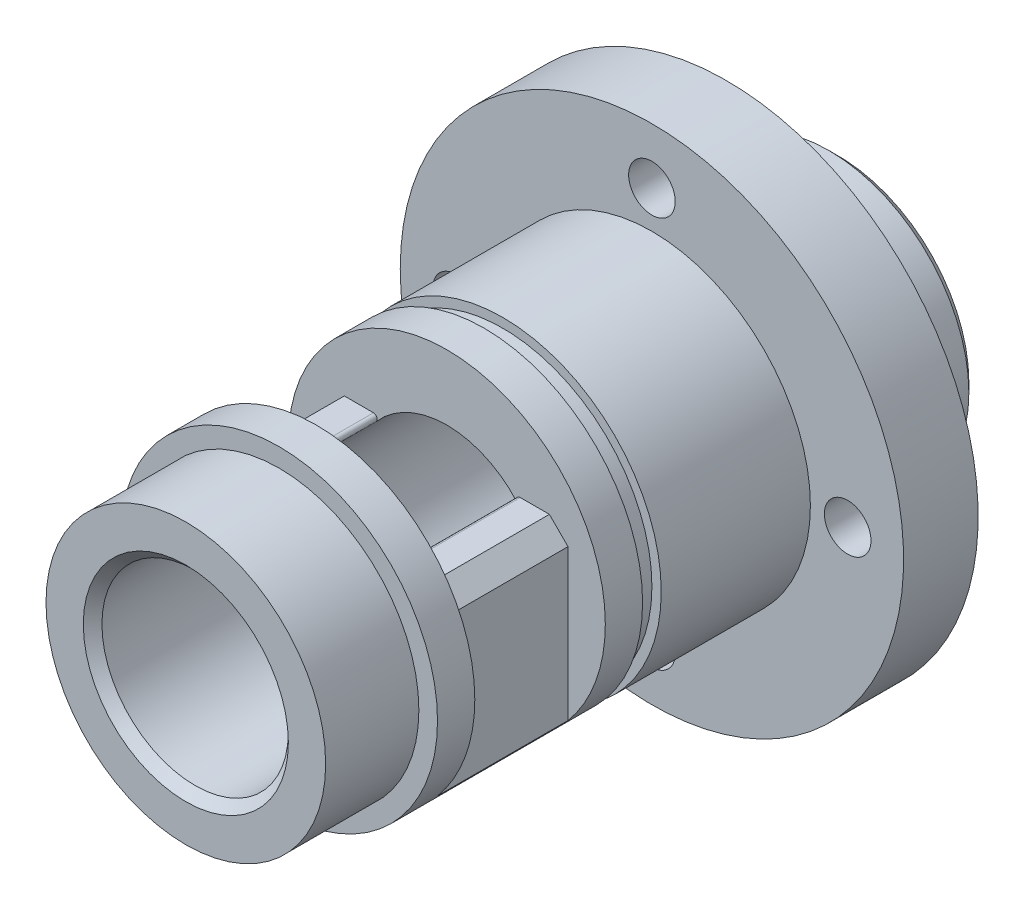
ISO-10303-21;
HEADER;
FILE_DESCRIPTION(('STEP AP214'),'2;1');
FILE_NAME('part.step','',(''),(''),'','','');
FILE_SCHEMA(('AUTOMOTIVE_DESIGN { 1 0 10303 214 1 1 1 1 }'));
ENDSEC;
DATA;
#1=APPLICATION_CONTEXT('core data for automotive mechanical design processes');
#2=APPLICATION_PROTOCOL_DEFINITION('international standard','automotive_design',2000,#1);
#3=PRODUCT_CONTEXT('',#1,'mechanical');
#4=PRODUCT('Part','Part','',(#3));
#5=PRODUCT_RELATED_PRODUCT_CATEGORY('part','',(#4));
#6=PRODUCT_DEFINITION_FORMATION('','',#4);
#7=PRODUCT_DEFINITION_CONTEXT('part definition',#1,'design');
#8=PRODUCT_DEFINITION('design','',#6,#7);
#9=PRODUCT_DEFINITION_SHAPE('','',#8);
#10=(LENGTH_UNIT() NAMED_UNIT(*) SI_UNIT(.MILLI.,.METRE.));
#11=(NAMED_UNIT(*) PLANE_ANGLE_UNIT() SI_UNIT($,.RADIAN.));
#12=(NAMED_UNIT(*) SI_UNIT($,.STERADIAN.) SOLID_ANGLE_UNIT());
#13=UNCERTAINTY_MEASURE_WITH_UNIT(LENGTH_MEASURE(1.E-05),#10,'distance_accuracy_value','');
#14=(GEOMETRIC_REPRESENTATION_CONTEXT(3) GLOBAL_UNCERTAINTY_ASSIGNED_CONTEXT((#13)) GLOBAL_UNIT_ASSIGNED_CONTEXT((#10,
#11,#12)) REPRESENTATION_CONTEXT('',''));
#15=CARTESIAN_POINT('',(0.,0.,0.));
#16=DIRECTION('',(0.,0.,1.));
#17=DIRECTION('',(1.,0.,0.));
#18=AXIS2_PLACEMENT_3D('',#15,#16,#17);
#19=CARTESIAN_POINT('',(0.,0.,20.));
#20=DIRECTION('',(0.,0.,-1.));
#21=DIRECTION('',(-1.,0.,0.));
#22=AXIS2_PLACEMENT_3D('',#19,#20,#21);
#23=CYLINDRICAL_SURFACE('',#22,8.5);
#24=CARTESIAN_POINT('',(0.,0.,11.));
#25=DIRECTION('',(0.,0.,1.));
#26=DIRECTION('',(1.,0.,0.));
#27=AXIS2_PLACEMENT_3D('',#24,#25,#26);
#28=CIRCLE('',#27,8.5);
#29=CARTESIAN_POINT('',(6.5,-5.47722557505166,11.));
#30=VERTEX_POINT('',#29);
#31=CARTESIAN_POINT('',(-6.5,-5.47722557505166,11.));
#32=VERTEX_POINT('',#31);
#33=EDGE_CURVE('E125',#30,#32,#28,.T.);
#34=ORIENTED_EDGE('',*,*,#33,.F.);
#35=DIRECTION('',(0.,0.,-1.));
#36=VECTOR('',#35,1.);
#37=CARTESIAN_POINT('',(6.5,-5.47722557505166,20.));
#38=LINE('',#37,#36);
#39=CARTESIAN_POINT('',(6.5,-5.47722557505166,18.));
#40=VERTEX_POINT('',#39);
#41=EDGE_CURVE('E128',#30,#40,#38,.F.);
#42=ORIENTED_EDGE('',*,*,#41,.T.);
#43=CARTESIAN_POINT('',(0.,0.,18.));
#44=DIRECTION('',(0.,0.,1.));
#45=DIRECTION('',(1.,0.,0.));
#46=AXIS2_PLACEMENT_3D('',#43,#44,#45);
#47=CIRCLE('',#46,8.5);
#48=CARTESIAN_POINT('',(-6.5,-5.47722557505167,18.));
#49=VERTEX_POINT('',#48);
#50=EDGE_CURVE('E178',#40,#49,#47,.T.);
#51=ORIENTED_EDGE('',*,*,#50,.T.);
#52=DIRECTION('',(0.,0.,-1.));
#53=VECTOR('',#52,1.);
#54=CARTESIAN_POINT('',(-6.5,-5.47722557505167,20.));
#55=LINE('',#54,#53);
#56=EDGE_CURVE('E130',#49,#32,#55,.T.);
#57=ORIENTED_EDGE('',*,*,#56,.T.);
#58=EDGE_LOOP('',(#34,#42,#51,#57));
#59=FACE_BOUND('',#58,.T.);
#60=CARTESIAN_POINT('',(0.,0.,9.));
#61=DIRECTION('',(0.,0.,1.));
#62=DIRECTION('',(1.,0.,0.));
#63=AXIS2_PLACEMENT_3D('',#60,#61,#62);
#64=CIRCLE('',#63,8.5);
#65=CARTESIAN_POINT('',(8.5,0.,9.));
#66=VERTEX_POINT('',#65);
#67=EDGE_CURVE('E210',#66,#66,#64,.T.);
#68=ORIENTED_EDGE('',*,*,#67,.T.);
#69=EDGE_LOOP('',(#68));
#70=FACE_BOUND('',#69,.T.);
#71=CARTESIAN_POINT('',(0.,0.,20.));
#72=DIRECTION('',(0.,0.,1.));
#73=DIRECTION('',(1.,0.,0.));
#74=AXIS2_PLACEMENT_3D('',#71,#72,#73);
#75=CIRCLE('',#74,8.5);
#76=CARTESIAN_POINT('',(8.5,0.,20.));
#77=VERTEX_POINT('',#76);
#78=EDGE_CURVE('E219',#77,#77,#75,.T.);
#79=ORIENTED_EDGE('',*,*,#78,.F.);
#80=EDGE_LOOP('',(#79));
#81=FACE_BOUND('',#80,.T.);
#82=CARTESIAN_POINT('',(0.,0.,11.));
#83=DIRECTION('',(0.,0.,1.));
#84=DIRECTION('',(1.,0.,0.));
#85=AXIS2_PLACEMENT_3D('',#82,#83,#84);
#86=CIRCLE('',#85,8.5);
#87=CARTESIAN_POINT('',(-6.02079728939615,-6.,11.));
#88=VERTEX_POINT('',#87);
#89=CARTESIAN_POINT('',(6.02079728939615,-6.,11.));
#90=VERTEX_POINT('',#89);
#91=EDGE_CURVE('E164',#88,#90,#86,.T.);
#92=ORIENTED_EDGE('',*,*,#91,.F.);
#93=DIRECTION('',(0.,0.,1.));
#94=VECTOR('',#93,1.);
#95=CARTESIAN_POINT('',(-6.02079728939615,-6.,11.));
#96=LINE('',#95,#94);
#97=CARTESIAN_POINT('',(-6.02079728939615,-6.,18.));
#98=VERTEX_POINT('',#97);
#99=EDGE_CURVE('E175',#88,#98,#96,.T.);
#100=ORIENTED_EDGE('',*,*,#99,.T.);
#101=CARTESIAN_POINT('',(0.,0.,18.));
#102=DIRECTION('',(0.,0.,1.));
#103=DIRECTION('',(1.,0.,0.));
#104=AXIS2_PLACEMENT_3D('',#101,#102,#103);
#105=CIRCLE('',#104,8.5);
#106=CARTESIAN_POINT('',(6.02079728939615,-6.,18.));
#107=VERTEX_POINT('',#106);
#108=EDGE_CURVE('E163',#98,#107,#105,.T.);
#109=ORIENTED_EDGE('',*,*,#108,.T.);
#110=DIRECTION('',(0.,0.,1.));
#111=VECTOR('',#110,1.);
#112=CARTESIAN_POINT('',(6.02079728939615,-6.,11.));
#113=LINE('',#112,#111);
#114=EDGE_CURVE('E170',#90,#107,#113,.T.);
#115=ORIENTED_EDGE('',*,*,#114,.F.);
#116=EDGE_LOOP('',(#92,#100,#109,#115));
#117=FACE_BOUND('',#116,.T.);
#118=ADVANCED_FACE('F37',(#59,#70,#81,#117),#23,.T.);
#119=CARTESIAN_POINT('',(0.,0.,25.));
#120=DIRECTION('',(0.,0.,-1.));
#121=DIRECTION('',(-1.,0.,0.));
#122=AXIS2_PLACEMENT_3D('',#119,#120,#121);
#123=CYLINDRICAL_SURFACE('',#122,5.);
#124=CARTESIAN_POINT('',(0.,0.,24.5));
#125=DIRECTION('',(0.,0.,1.));
#126=DIRECTION('',(1.,0.,0.));
#127=AXIS2_PLACEMENT_3D('',#124,#125,#126);
#128=CIRCLE('',#127,5.);
#129=CARTESIAN_POINT('',(5.,0.,24.5));
#130=VERTEX_POINT('',#129);
#131=EDGE_CURVE('E237',#130,#130,#128,.T.);
#132=ORIENTED_EDGE('',*,*,#131,.T.);
#133=EDGE_LOOP('',(#132));
#134=FACE_BOUND('',#133,.T.);
#135=CARTESIAN_POINT('',(0.,0.,-10.));
#136=DIRECTION('',(0.,0.,-1.));
#137=DIRECTION('',(-1.,0.,0.));
#138=AXIS2_PLACEMENT_3D('',#135,#136,#137);
#139=CIRCLE('',#138,5.);
#140=CARTESIAN_POINT('',(-5.,0.,-10.));
#141=VERTEX_POINT('',#140);
#142=EDGE_CURVE('E184',#141,#141,#139,.T.);
#143=ORIENTED_EDGE('',*,*,#142,.T.);
#144=EDGE_LOOP('',(#143));
#145=FACE_BOUND('',#144,.T.);
#146=DIRECTION('',(0.,0.,-1.));
#147=VECTOR('',#146,1.);
#148=CARTESIAN_POINT('',(-3.78313761017423,3.26923076923077,25.));
#149=LINE('',#148,#147);
#150=CARTESIAN_POINT('',(-3.78313761017423,3.26923076923077,11.));
#151=VERTEX_POINT('',#150);
#152=CARTESIAN_POINT('',(-3.78313761017423,3.26923076923077,18.));
#153=VERTEX_POINT('',#152);
#154=EDGE_CURVE('E261',#151,#153,#149,.F.);
#155=ORIENTED_EDGE('',*,*,#154,.T.);
#156=CARTESIAN_POINT('',(0.,0.,18.));
#157=DIRECTION('',(0.,0.,1.));
#158=DIRECTION('',(1.,0.,0.));
#159=AXIS2_PLACEMENT_3D('',#156,#157,#158);
#160=CIRCLE('',#159,5.);
#161=CARTESIAN_POINT('',(3.78313761017423,3.26923076923077,18.));
#162=VERTEX_POINT('',#161);
#163=EDGE_CURVE('E230',#153,#162,#160,.F.);
#164=ORIENTED_EDGE('',*,*,#163,.T.);
#165=DIRECTION('',(0.,0.,-1.));
#166=VECTOR('',#165,1.);
#167=CARTESIAN_POINT('',(3.78313761017423,3.26923076923077,25.));
#168=LINE('',#167,#166);
#169=CARTESIAN_POINT('',(3.78313761017423,3.26923076923077,11.));
#170=VERTEX_POINT('',#169);
#171=EDGE_CURVE('E258',#162,#170,#168,.T.);
#172=ORIENTED_EDGE('',*,*,#171,.T.);
#173=CARTESIAN_POINT('',(0.,0.,11.));
#174=DIRECTION('',(0.,0.,1.));
#175=DIRECTION('',(1.,0.,0.));
#176=AXIS2_PLACEMENT_3D('',#173,#174,#175);
#177=CIRCLE('',#176,5.);
#178=EDGE_CURVE('E232',#151,#170,#177,.F.);
#179=ORIENTED_EDGE('',*,*,#178,.F.);
#180=EDGE_LOOP('',(#155,#164,#172,#179));
#181=FACE_BOUND('',#180,.T.);
#182=ADVANCED_FACE('F279',(#134,#145,#181),#123,.F.);
#183=CARTESIAN_POINT('',(0.,0.,20.));
#184=DIRECTION('',(0.,0.,1.));
#185=DIRECTION('',(1.,0.,0.));
#186=AXIS2_PLACEMENT_3D('',#183,#184,#185);
#187=PLANE('',#186);
#188=CARTESIAN_POINT('',(0.,0.,20.));
#189=DIRECTION('',(0.,0.,1.));
#190=DIRECTION('',(1.,0.,0.));
#191=AXIS2_PLACEMENT_3D('',#188,#189,#190);
#192=CIRCLE('',#191,7.5);
#193=CARTESIAN_POINT('',(7.5,0.,20.));
#194=VERTEX_POINT('',#193);
#195=EDGE_CURVE('E213',#194,#194,#192,.T.);
#196=ORIENTED_EDGE('',*,*,#195,.F.);
#197=EDGE_LOOP('',(#196));
#198=FACE_BOUND('',#197,.T.);
#199=ORIENTED_EDGE('',*,*,#78,.T.);
#200=EDGE_LOOP('',(#199));
#201=FACE_BOUND('',#200,.T.);
#202=ADVANCED_FACE('F314',(#198,#201),#187,.T.);
#203=CARTESIAN_POINT('',(0.,0.,25.));
#204=DIRECTION('',(0.,0.,-1.));
#205=DIRECTION('',(-1.,0.,0.));
#206=AXIS2_PLACEMENT_3D('',#203,#204,#205);
#207=CYLINDRICAL_SURFACE('',#206,7.5);
#208=CARTESIAN_POINT('',(0.,0.,25.));
#209=DIRECTION('',(0.,0.,1.));
#210=DIRECTION('',(1.,0.,0.));
#211=AXIS2_PLACEMENT_3D('',#208,#209,#210);
#212=CIRCLE('',#211,7.5);
#213=CARTESIAN_POINT('',(7.5,0.,25.));
#214=VERTEX_POINT('',#213);
#215=EDGE_CURVE('E216',#214,#214,#212,.T.);
#216=ORIENTED_EDGE('',*,*,#215,.F.);
#217=EDGE_LOOP('',(#216));
#218=FACE_BOUND('',#217,.T.);
#219=ORIENTED_EDGE('',*,*,#195,.T.);
#220=EDGE_LOOP('',(#219));
#221=FACE_BOUND('',#220,.T.);
#222=ADVANCED_FACE('F352',(#218,#221),#207,.T.);
#223=CARTESIAN_POINT('',(0.,0.,25.));
#224=DIRECTION('',(0.,0.,1.));
#225=DIRECTION('',(1.,0.,0.));
#226=AXIS2_PLACEMENT_3D('',#223,#224,#225);
#227=PLANE('',#226);
#228=CARTESIAN_POINT('',(0.,0.,25.));
#229=DIRECTION('',(0.,0.,1.));
#230=DIRECTION('',(1.,0.,0.));
#231=AXIS2_PLACEMENT_3D('',#228,#229,#230);
#232=CIRCLE('',#231,5.50000000000001);
#233=CARTESIAN_POINT('',(5.50000000000001,0.,25.));
#234=VERTEX_POINT('',#233);
#235=EDGE_CURVE('E234',#234,#234,#232,.F.);
#236=ORIENTED_EDGE('',*,*,#235,.T.);
#237=EDGE_LOOP('',(#236));
#238=FACE_BOUND('',#237,.T.);
#239=ORIENTED_EDGE('',*,*,#215,.T.);
#240=EDGE_LOOP('',(#239));
#241=FACE_BOUND('',#240,.T.);
#242=ADVANCED_FACE('F346',(#238,#241),#227,.T.);
#243=CARTESIAN_POINT('',(0.,0.,9.));
#244=DIRECTION('',(0.,0.,1.));
#245=DIRECTION('',(1.,0.,0.));
#246=AXIS2_PLACEMENT_3D('',#243,#244,#245);
#247=PLANE('',#246);
#248=ORIENTED_EDGE('',*,*,#67,.F.);
#249=EDGE_LOOP('',(#248));
#250=FACE_BOUND('',#249,.T.);
#251=CARTESIAN_POINT('',(0.,0.,9.));
#252=DIRECTION('',(0.,0.,1.));
#253=DIRECTION('',(1.,0.,0.));
#254=AXIS2_PLACEMENT_3D('',#251,#252,#253);
#255=CIRCLE('',#254,8.);
#256=CARTESIAN_POINT('',(8.,0.,9.));
#257=VERTEX_POINT('',#256);
#258=EDGE_CURVE('E204',#257,#257,#255,.T.);
#259=ORIENTED_EDGE('',*,*,#258,.T.);
#260=EDGE_LOOP('',(#259));
#261=FACE_BOUND('',#260,.T.);
#262=ADVANCED_FACE('F339',(#250,#261),#247,.F.);
#263=CARTESIAN_POINT('',(0.,0.,8.));
#264=DIRECTION('',(0.,0.,1.));
#265=DIRECTION('',(1.,0.,0.));
#266=AXIS2_PLACEMENT_3D('',#263,#264,#265);
#267=PLANE('',#266);
#268=CARTESIAN_POINT('',(0.,0.,8.));
#269=DIRECTION('',(0.,0.,1.));
#270=DIRECTION('',(1.,0.,0.));
#271=AXIS2_PLACEMENT_3D('',#268,#269,#270);
#272=CIRCLE('',#271,8.5);
#273=CARTESIAN_POINT('',(8.5,0.,8.));
#274=VERTEX_POINT('',#273);
#275=EDGE_CURVE('E207',#274,#274,#272,.T.);
#276=ORIENTED_EDGE('',*,*,#275,.T.);
#277=EDGE_LOOP('',(#276));
#278=FACE_BOUND('',#277,.T.);
#279=CARTESIAN_POINT('',(0.,0.,8.));
#280=DIRECTION('',(0.,0.,1.));
#281=DIRECTION('',(1.,0.,0.));
#282=AXIS2_PLACEMENT_3D('',#279,#280,#281);
#283=CIRCLE('',#282,8.);
#284=CARTESIAN_POINT('',(8.,0.,8.));
#285=VERTEX_POINT('',#284);
#286=EDGE_CURVE('E203',#285,#285,#283,.T.);
#287=ORIENTED_EDGE('',*,*,#286,.F.);
#288=EDGE_LOOP('',(#287));
#289=FACE_BOUND('',#288,.T.);
#290=ADVANCED_FACE('F330',(#278,#289),#267,.T.);
#291=CARTESIAN_POINT('',(0.,0.,9.));
#292=DIRECTION('',(0.,0.,-1.));
#293=DIRECTION('',(-1.,0.,0.));
#294=AXIS2_PLACEMENT_3D('',#291,#292,#293);
#295=CYLINDRICAL_SURFACE('',#294,8.);
#296=ORIENTED_EDGE('',*,*,#258,.F.);
#297=EDGE_LOOP('',(#296));
#298=FACE_BOUND('',#297,.T.);
#299=ORIENTED_EDGE('',*,*,#286,.T.);
#300=EDGE_LOOP('',(#299));
#301=FACE_BOUND('',#300,.T.);
#302=ADVANCED_FACE('F321',(#298,#301),#295,.T.);
#303=CARTESIAN_POINT('',(0.,0.,0.));
#304=DIRECTION('',(0.,0.,-1.));
#305=DIRECTION('',(-1.,0.,0.));
#306=AXIS2_PLACEMENT_3D('',#303,#304,#305);
#307=CIRCLE('',#306,8.5);
#308=CARTESIAN_POINT('',(-8.5,0.,0.));
#309=VERTEX_POINT('',#308);
#310=EDGE_CURVE('E198',#309,#309,#307,.T.);
#311=ORIENTED_EDGE('',*,*,#310,.F.);
#312=EDGE_LOOP('',(#311));
#313=FACE_BOUND('',#312,.T.);
#314=ORIENTED_EDGE('',*,*,#275,.F.);
#315=EDGE_LOOP('',(#314));
#316=FACE_BOUND('',#315,.T.);
#317=ADVANCED_FACE('F310',(#313,#316),#23,.T.);
#318=CARTESIAN_POINT('',(0.,0.,-4.));
#319=DIRECTION('',(0.,0.,1.));
#320=DIRECTION('',(1.,0.,0.));
#321=AXIS2_PLACEMENT_3D('',#318,#319,#320);
#322=CYLINDRICAL_SURFACE('',#321,13.5);
#323=CARTESIAN_POINT('',(0.,0.,-4.));
#324=DIRECTION('',(0.,0.,-1.));
#325=DIRECTION('',(-1.,0.,0.));
#326=AXIS2_PLACEMENT_3D('',#323,#324,#325);
#327=CIRCLE('',#326,13.5);
#328=CARTESIAN_POINT('',(-13.5,0.,-4.));
#329=VERTEX_POINT('',#328);
#330=EDGE_CURVE('E195',#329,#329,#327,.T.);
#331=ORIENTED_EDGE('',*,*,#330,.F.);
#332=EDGE_LOOP('',(#331));
#333=FACE_BOUND('',#332,.T.);
#334=CARTESIAN_POINT('',(0.,0.,0.));
#335=DIRECTION('',(0.,0.,-1.));
#336=DIRECTION('',(-1.,0.,0.));
#337=AXIS2_PLACEMENT_3D('',#334,#335,#336);
#338=CIRCLE('',#337,13.5);
#339=CARTESIAN_POINT('',(-13.5,0.,0.));
#340=VERTEX_POINT('',#339);
#341=EDGE_CURVE('E194',#340,#340,#338,.T.);
#342=ORIENTED_EDGE('',*,*,#341,.T.);
#343=EDGE_LOOP('',(#342));
#344=FACE_BOUND('',#343,.T.);
#345=ADVANCED_FACE('F320',(#333,#344),#322,.T.);
#346=CARTESIAN_POINT('',(0.,0.,-4.));
#347=DIRECTION('',(0.,0.,-1.));
#348=DIRECTION('',(-1.,0.,0.));
#349=AXIS2_PLACEMENT_3D('',#346,#347,#348);
#350=PLANE('',#349);
#351=CARTESIAN_POINT('',(10.5,0.,-4.));
#352=DIRECTION('',(0.,0.,-1.));
#353=DIRECTION('',(-1.,0.,0.));
#354=AXIS2_PLACEMENT_3D('',#351,#352,#353);
#355=CIRCLE('',#354,1.24999999999999);
#356=CARTESIAN_POINT('',(9.25000000000001,0.,-4.));
#357=VERTEX_POINT('',#356);
#358=EDGE_CURVE('E445',#357,#357,#355,.T.);
#359=ORIENTED_EDGE('',*,*,#358,.F.);
#360=EDGE_LOOP('',(#359));
#361=FACE_BOUND('',#360,.T.);
#362=CARTESIAN_POINT('',(0.,10.5,-4.));
#363=DIRECTION('',(0.,0.,-1.));
#364=DIRECTION('',(-1.,0.,0.));
#365=AXIS2_PLACEMENT_3D('',#362,#363,#364);
#366=CIRCLE('',#365,1.24999999999999);
#367=CARTESIAN_POINT('',(-1.24999999999999,10.5,-4.));
#368=VERTEX_POINT('',#367);
#369=EDGE_CURVE('E441',#368,#368,#366,.T.);
#370=ORIENTED_EDGE('',*,*,#369,.F.);
#371=EDGE_LOOP('',(#370));
#372=FACE_BOUND('',#371,.T.);
#373=CARTESIAN_POINT('',(-10.5,0.,-4.));
#374=DIRECTION('',(0.,0.,-1.));
#375=DIRECTION('',(-1.,0.,0.));
#376=AXIS2_PLACEMENT_3D('',#373,#374,#375);
#377=CIRCLE('',#376,1.24999999999999);
#378=CARTESIAN_POINT('',(-11.75,0.,-4.));
#379=VERTEX_POINT('',#378);
#380=EDGE_CURVE('E435',#379,#379,#377,.T.);
#381=ORIENTED_EDGE('',*,*,#380,.F.);
#382=EDGE_LOOP('',(#381));
#383=FACE_BOUND('',#382,.T.);
#384=CARTESIAN_POINT('',(0.,-10.5,-4.));
#385=DIRECTION('',(0.,0.,-1.));
#386=DIRECTION('',(-1.,0.,0.));
#387=AXIS2_PLACEMENT_3D('',#384,#385,#386);
#388=CIRCLE('',#387,1.24999999999999);
#389=CARTESIAN_POINT('',(-1.24999999999999,-10.5,-4.));
#390=VERTEX_POINT('',#389);
#391=EDGE_CURVE('E155',#390,#390,#388,.T.);
#392=ORIENTED_EDGE('',*,*,#391,.F.);
#393=EDGE_LOOP('',(#392));
#394=FACE_BOUND('',#393,.T.);
#395=CARTESIAN_POINT('',(0.,0.,-4.));
#396=DIRECTION('',(0.,0.,-1.));
#397=DIRECTION('',(-1.,0.,0.));
#398=AXIS2_PLACEMENT_3D('',#395,#396,#397);
#399=CIRCLE('',#398,7.5);
#400=CARTESIAN_POINT('',(-7.5,0.,-4.));
#401=VERTEX_POINT('',#400);
#402=EDGE_CURVE('E191',#401,#401,#399,.T.);
#403=ORIENTED_EDGE('',*,*,#402,.F.);
#404=EDGE_LOOP('',(#403));
#405=FACE_BOUND('',#404,.T.);
#406=ORIENTED_EDGE('',*,*,#330,.T.);
#407=EDGE_LOOP('',(#406));
#408=FACE_BOUND('',#407,.T.);
#409=ADVANCED_FACE('F327',(#361,#372,#383,#394,#405,#408),#350,.T.);
#410=CARTESIAN_POINT('',(0.,0.,0.));
#411=DIRECTION('',(0.,0.,-1.));
#412=DIRECTION('',(-1.,0.,0.));
#413=AXIS2_PLACEMENT_3D('',#410,#411,#412);
#414=PLANE('',#413);
#415=CARTESIAN_POINT('',(10.5,0.,0.));
#416=DIRECTION('',(0.,0.,-1.));
#417=DIRECTION('',(-1.,0.,0.));
#418=AXIS2_PLACEMENT_3D('',#415,#416,#417);
#419=CIRCLE('',#418,1.24999999999999);
#420=CARTESIAN_POINT('',(9.25000000000001,0.,0.));
#421=VERTEX_POINT('',#420);
#422=EDGE_CURVE('E411',#421,#421,#419,.T.);
#423=ORIENTED_EDGE('',*,*,#422,.T.);
#424=EDGE_LOOP('',(#423));
#425=FACE_BOUND('',#424,.T.);
#426=CARTESIAN_POINT('',(0.,10.5,0.));
#427=DIRECTION('',(0.,0.,-1.));
#428=DIRECTION('',(-1.,0.,0.));
#429=AXIS2_PLACEMENT_3D('',#426,#427,#428);
#430=CIRCLE('',#429,1.24999999999999);
#431=CARTESIAN_POINT('',(-1.24999999999999,10.5,0.));
#432=VERTEX_POINT('',#431);
#433=EDGE_CURVE('E415',#432,#432,#430,.T.);
#434=ORIENTED_EDGE('',*,*,#433,.T.);
#435=EDGE_LOOP('',(#434));
#436=FACE_BOUND('',#435,.T.);
#437=CARTESIAN_POINT('',(-10.5,0.,0.));
#438=DIRECTION('',(0.,0.,-1.));
#439=DIRECTION('',(-1.,0.,0.));
#440=AXIS2_PLACEMENT_3D('',#437,#438,#439);
#441=CIRCLE('',#440,1.24999999999999);
#442=CARTESIAN_POINT('',(-11.75,0.,0.));
#443=VERTEX_POINT('',#442);
#444=EDGE_CURVE('E419',#443,#443,#441,.T.);
#445=ORIENTED_EDGE('',*,*,#444,.T.);
#446=EDGE_LOOP('',(#445));
#447=FACE_BOUND('',#446,.T.);
#448=CARTESIAN_POINT('',(0.,-10.5,0.));
#449=DIRECTION('',(0.,0.,-1.));
#450=DIRECTION('',(-1.,0.,0.));
#451=AXIS2_PLACEMENT_3D('',#448,#449,#450);
#452=CIRCLE('',#451,1.24999999999999);
#453=CARTESIAN_POINT('',(-1.24999999999999,-10.5,0.));
#454=VERTEX_POINT('',#453);
#455=EDGE_CURVE('E151',#454,#454,#452,.T.);
#456=ORIENTED_EDGE('',*,*,#455,.T.);
#457=EDGE_LOOP('',(#456));
#458=FACE_BOUND('',#457,.T.);
#459=ORIENTED_EDGE('',*,*,#310,.T.);
#460=EDGE_LOOP('',(#459));
#461=FACE_BOUND('',#460,.T.);
#462=ORIENTED_EDGE('',*,*,#341,.F.);
#463=EDGE_LOOP('',(#462));
#464=FACE_BOUND('',#463,.T.);
#465=ADVANCED_FACE('F399',(#425,#436,#447,#458,#461,#464),#414,.F.);
#466=CARTESIAN_POINT('',(0.,0.,-10.));
#467=DIRECTION('',(0.,0.,1.));
#468=DIRECTION('',(1.,0.,0.));
#469=AXIS2_PLACEMENT_3D('',#466,#467,#468);
#470=CYLINDRICAL_SURFACE('',#469,7.5);
#471=CARTESIAN_POINT('',(0.,0.,-9.50000000000001));
#472=DIRECTION('',(0.,0.,-1.));
#473=DIRECTION('',(-1.,0.,0.));
#474=AXIS2_PLACEMENT_3D('',#471,#472,#473);
#475=CIRCLE('',#474,7.5);
#476=CARTESIAN_POINT('',(-7.5,0.,-9.50000000000001));
#477=VERTEX_POINT('',#476);
#478=EDGE_CURVE('E227',#477,#477,#475,.F.);
#479=ORIENTED_EDGE('',*,*,#478,.T.);
#480=EDGE_LOOP('',(#479));
#481=FACE_BOUND('',#480,.T.);
#482=ORIENTED_EDGE('',*,*,#402,.T.);
#483=EDGE_LOOP('',(#482));
#484=FACE_BOUND('',#483,.T.);
#485=ADVANCED_FACE('F395',(#481,#484),#470,.T.);
#486=CARTESIAN_POINT('',(0.,0.,-10.));
#487=DIRECTION('',(0.,0.,-1.));
#488=DIRECTION('',(-1.,0.,0.));
#489=AXIS2_PLACEMENT_3D('',#486,#487,#488);
#490=PLANE('',#489);
#491=CARTESIAN_POINT('',(0.,0.,-10.));
#492=DIRECTION('',(0.,0.,-1.));
#493=DIRECTION('',(-1.,0.,0.));
#494=AXIS2_PLACEMENT_3D('',#491,#492,#493);
#495=CIRCLE('',#494,7.00000000000001);
#496=CARTESIAN_POINT('',(-7.00000000000001,0.,-10.));
#497=VERTEX_POINT('',#496);
#498=EDGE_CURVE('E224',#497,#497,#495,.T.);
#499=ORIENTED_EDGE('',*,*,#498,.T.);
#500=EDGE_LOOP('',(#499));
#501=FACE_BOUND('',#500,.T.);
#502=ORIENTED_EDGE('',*,*,#142,.F.);
#503=EDGE_LOOP('',(#502));
#504=FACE_BOUND('',#503,.T.);
#505=ADVANCED_FACE('F392',(#501,#504),#490,.T.);
#506=CARTESIAN_POINT('',(0.,0.,-10.));
#507=DIRECTION('',(0.,0.,1.));
#508=DIRECTION('',(1.,0.,0.));
#509=AXIS2_PLACEMENT_3D('',#506,#507,#508);
#510=CONICAL_SURFACE('',#509,7.00000000000001,0.785398163397444);
#511=ORIENTED_EDGE('',*,*,#478,.F.);
#512=EDGE_LOOP('',(#511));
#513=FACE_BOUND('',#512,.T.);
#514=ORIENTED_EDGE('',*,*,#498,.F.);
#515=EDGE_LOOP('',(#514));
#516=FACE_BOUND('',#515,.T.);
#517=ADVANCED_FACE('F390',(#513,#516),#510,.T.);
#518=CARTESIAN_POINT('',(-7.7,3.6,11.));
#519=DIRECTION('',(0.,-1.,0.));
#520=DIRECTION('',(0.,0.,-1.));
#521=AXIS2_PLACEMENT_3D('',#518,#519,#520);
#522=PLANE('',#521);
#523=DIRECTION('',(1.,0.,0.));
#524=VECTOR('',#523,1.);
#525=CARTESIAN_POINT('',(-7.7,3.6,18.));
#526=LINE('',#525,#524);
#527=CARTESIAN_POINT('',(-5.5,3.6,18.));
#528=VERTEX_POINT('',#527);
#529=CARTESIAN_POINT('',(-3.9344631145812,3.6,18.));
#530=VERTEX_POINT('',#529);
#531=EDGE_CURVE('E135',#528,#530,#526,.T.);
#532=ORIENTED_EDGE('',*,*,#531,.T.);
#533=DIRECTION('',(0.,0.,-1.));
#534=VECTOR('',#533,1.);
#535=CARTESIAN_POINT('',(-3.9344631145812,3.6,11.));
#536=LINE('',#535,#534);
#537=CARTESIAN_POINT('',(-3.9344631145812,3.6,11.));
#538=VERTEX_POINT('',#537);
#539=EDGE_CURVE('E264',#530,#538,#536,.T.);
#540=ORIENTED_EDGE('',*,*,#539,.T.);
#541=DIRECTION('',(1.,0.,0.));
#542=VECTOR('',#541,1.);
#543=CARTESIAN_POINT('',(-7.7,3.6,11.));
#544=LINE('',#543,#542);
#545=CARTESIAN_POINT('',(-5.5,3.6,11.));
#546=VERTEX_POINT('',#545);
#547=EDGE_CURVE('E181',#546,#538,#544,.T.);
#548=ORIENTED_EDGE('',*,*,#547,.F.);
#549=DIRECTION('',(0.,0.,1.));
#550=VECTOR('',#549,1.);
#551=CARTESIAN_POINT('',(-5.5,3.6,11.));
#552=LINE('',#551,#550);
#553=EDGE_CURVE('E248',#546,#528,#552,.T.);
#554=ORIENTED_EDGE('',*,*,#553,.T.);
#555=EDGE_LOOP('',(#532,#540,#548,#554));
#556=FACE_BOUND('',#555,.T.);
#557=ADVANCED_FACE('F297',(#556),#522,.F.);
#558=CARTESIAN_POINT('',(3.9344631145812,3.6,11.));
#559=VERTEX_POINT('',#558);
#560=CARTESIAN_POINT('',(5.5,3.6,11.));
#561=VERTEX_POINT('',#560);
#562=EDGE_CURVE('E134',#559,#561,#544,.T.);
#563=ORIENTED_EDGE('',*,*,#562,.F.);
#564=DIRECTION('',(0.,0.,-1.));
#565=VECTOR('',#564,1.);
#566=CARTESIAN_POINT('',(3.9344631145812,3.6,11.));
#567=LINE('',#566,#565);
#568=CARTESIAN_POINT('',(3.9344631145812,3.6,18.));
#569=VERTEX_POINT('',#568);
#570=EDGE_CURVE('E58',#559,#569,#567,.F.);
#571=ORIENTED_EDGE('',*,*,#570,.T.);
#572=CARTESIAN_POINT('',(5.5,3.6,18.));
#573=VERTEX_POINT('',#572);
#574=EDGE_CURVE('E186',#569,#573,#526,.T.);
#575=ORIENTED_EDGE('',*,*,#574,.T.);
#576=DIRECTION('',(0.,0.,-1.));
#577=VECTOR('',#576,1.);
#578=CARTESIAN_POINT('',(5.5,3.6,11.));
#579=LINE('',#578,#577);
#580=EDGE_CURVE('E242',#573,#561,#579,.T.);
#581=ORIENTED_EDGE('',*,*,#580,.T.);
#582=EDGE_LOOP('',(#563,#571,#575,#581));
#583=FACE_BOUND('',#582,.T.);
#584=ADVANCED_FACE('F287',(#583),#522,.F.);
#585=CARTESIAN_POINT('',(0.,0.,11.));
#586=DIRECTION('',(0.,0.,1.));
#587=DIRECTION('',(1.,0.,0.));
#588=AXIS2_PLACEMENT_3D('',#585,#586,#587);
#589=PLANE('',#588);
#590=ORIENTED_EDGE('',*,*,#178,.T.);
#591=CARTESIAN_POINT('',(3.9344631145812,3.4,11.));
#592=DIRECTION('',(0.,0.,1.));
#593=DIRECTION('',(1.,0.,0.));
#594=AXIS2_PLACEMENT_3D('',#591,#592,#593);
#595=CIRCLE('',#594,0.2);
#596=EDGE_CURVE('E45',#170,#559,#595,.F.);
#597=ORIENTED_EDGE('',*,*,#596,.T.);
#598=ORIENTED_EDGE('',*,*,#562,.T.);
#599=DIRECTION('',(-0.707106781186549,0.707106781186546,0.));
#600=VECTOR('',#599,1.);
#601=CARTESIAN_POINT('',(6.5,2.6,11.));
#602=LINE('',#601,#600);
#603=CARTESIAN_POINT('',(6.5,2.6,11.));
#604=VERTEX_POINT('',#603);
#605=EDGE_CURVE('E150',#561,#604,#602,.F.);
#606=ORIENTED_EDGE('',*,*,#605,.T.);
#607=DIRECTION('',(0.,1.,0.));
#608=VECTOR('',#607,1.);
#609=CARTESIAN_POINT('',(6.5,-13.5,11.));
#610=LINE('',#609,#608);
#611=EDGE_CURVE('E142',#30,#604,#610,.T.);
#612=ORIENTED_EDGE('',*,*,#611,.F.);
#613=ORIENTED_EDGE('',*,*,#33,.T.);
#614=DIRECTION('',(0.,1.,0.));
#615=VECTOR('',#614,1.);
#616=CARTESIAN_POINT('',(-6.5,-13.5,11.));
#617=LINE('',#616,#615);
#618=CARTESIAN_POINT('',(-6.5,2.6,11.));
#619=VERTEX_POINT('',#618);
#620=EDGE_CURVE('E146',#32,#619,#617,.T.);
#621=ORIENTED_EDGE('',*,*,#620,.T.);
#622=DIRECTION('',(-0.70710678118655,-0.707106781186545,0.));
#623=VECTOR('',#622,1.);
#624=CARTESIAN_POINT('',(-6.5,2.6,11.));
#625=LINE('',#624,#623);
#626=EDGE_CURVE('E254',#619,#546,#625,.F.);
#627=ORIENTED_EDGE('',*,*,#626,.T.);
#628=ORIENTED_EDGE('',*,*,#547,.T.);
#629=CARTESIAN_POINT('',(-3.9344631145812,3.4,11.));
#630=DIRECTION('',(0.,0.,1.));
#631=DIRECTION('',(1.,0.,0.));
#632=AXIS2_PLACEMENT_3D('',#629,#630,#631);
#633=CIRCLE('',#632,0.2);
#634=EDGE_CURVE('E269',#538,#151,#633,.F.);
#635=ORIENTED_EDGE('',*,*,#634,.T.);
#636=EDGE_LOOP('',(#590,#597,#598,#606,#612,#613,#621,#627,#628,#635));
#637=FACE_BOUND('',#636,.T.);
#638=ADVANCED_FACE('F148',(#637),#589,.T.);
#639=CARTESIAN_POINT('',(0.,0.,18.));
#640=DIRECTION('',(0.,0.,1.));
#641=DIRECTION('',(1.,0.,0.));
#642=AXIS2_PLACEMENT_3D('',#639,#640,#641);
#643=PLANE('',#642);
#644=ORIENTED_EDGE('',*,*,#531,.F.);
#645=DIRECTION('',(0.70710678118655,0.707106781186545,0.));
#646=VECTOR('',#645,1.);
#647=CARTESIAN_POINT('',(-4.54999999999998,4.55000000000001,18.));
#648=LINE('',#647,#646);
#649=CARTESIAN_POINT('',(-6.5,2.6,18.));
#650=VERTEX_POINT('',#649);
#651=EDGE_CURVE('E256',#528,#650,#648,.F.);
#652=ORIENTED_EDGE('',*,*,#651,.T.);
#653=DIRECTION('',(0.,1.,0.));
#654=VECTOR('',#653,1.);
#655=CARTESIAN_POINT('',(-6.5,-13.5,18.));
#656=LINE('',#655,#654);
#657=EDGE_CURVE('E158',#49,#650,#656,.T.);
#658=ORIENTED_EDGE('',*,*,#657,.F.);
#659=ORIENTED_EDGE('',*,*,#50,.F.);
#660=DIRECTION('',(0.,1.,0.));
#661=VECTOR('',#660,1.);
#662=CARTESIAN_POINT('',(6.5,-13.5,18.));
#663=LINE('',#662,#661);
#664=CARTESIAN_POINT('',(6.5,2.6,18.));
#665=VERTEX_POINT('',#664);
#666=EDGE_CURVE('E145',#40,#665,#663,.T.);
#667=ORIENTED_EDGE('',*,*,#666,.T.);
#668=DIRECTION('',(0.707106781186549,-0.707106781186546,0.));
#669=VECTOR('',#668,1.);
#670=CARTESIAN_POINT('',(4.54999999999999,4.55000000000001,18.));
#671=LINE('',#670,#669);
#672=EDGE_CURVE('E250',#665,#573,#671,.F.);
#673=ORIENTED_EDGE('',*,*,#672,.T.);
#674=ORIENTED_EDGE('',*,*,#574,.F.);
#675=CARTESIAN_POINT('',(3.9344631145812,3.4,18.));
#676=DIRECTION('',(0.,0.,1.));
#677=DIRECTION('',(1.,0.,0.));
#678=AXIS2_PLACEMENT_3D('',#675,#676,#677);
#679=CIRCLE('',#678,0.2);
#680=EDGE_CURVE('E11',#569,#162,#679,.T.);
#681=ORIENTED_EDGE('',*,*,#680,.T.);
#682=ORIENTED_EDGE('',*,*,#163,.F.);
#683=CARTESIAN_POINT('',(-3.9344631145812,3.4,18.));
#684=DIRECTION('',(0.,0.,1.));
#685=DIRECTION('',(1.,0.,0.));
#686=AXIS2_PLACEMENT_3D('',#683,#684,#685);
#687=CIRCLE('',#686,0.2);
#688=EDGE_CURVE('E267',#153,#530,#687,.T.);
#689=ORIENTED_EDGE('',*,*,#688,.T.);
#690=EDGE_LOOP('',(#644,#652,#658,#659,#667,#673,#674,#681,#682,#689));
#691=FACE_BOUND('',#690,.T.);
#692=ADVANCED_FACE('F285',(#691),#643,.F.);
#693=CARTESIAN_POINT('',(-6.02079728939615,-6.,11.));
#694=DIRECTION('',(0.,1.,0.));
#695=DIRECTION('',(0.,0.,1.));
#696=AXIS2_PLACEMENT_3D('',#693,#694,#695);
#697=PLANE('',#696);
#698=DIRECTION('',(-1.,0.,0.));
#699=VECTOR('',#698,1.);
#700=CARTESIAN_POINT('',(-6.02079728939615,-6.,18.));
#701=LINE('',#700,#699);
#702=EDGE_CURVE('E167',#107,#98,#701,.T.);
#703=ORIENTED_EDGE('',*,*,#702,.T.);
#704=ORIENTED_EDGE('',*,*,#99,.F.);
#705=DIRECTION('',(-1.,0.,0.));
#706=VECTOR('',#705,1.);
#707=CARTESIAN_POINT('',(-6.02079728939615,-6.,11.));
#708=LINE('',#707,#706);
#709=EDGE_CURVE('E166',#90,#88,#708,.T.);
#710=ORIENTED_EDGE('',*,*,#709,.F.);
#711=ORIENTED_EDGE('',*,*,#114,.T.);
#712=EDGE_LOOP('',(#703,#704,#710,#711));
#713=FACE_BOUND('',#712,.T.);
#714=ADVANCED_FACE('F371',(#713),#697,.F.);
#715=CARTESIAN_POINT('',(0.,0.,11.));
#716=DIRECTION('',(0.,0.,1.));
#717=DIRECTION('',(1.,0.,0.));
#718=AXIS2_PLACEMENT_3D('',#715,#716,#717);
#719=PLANE('',#718);
#720=ORIENTED_EDGE('',*,*,#91,.T.);
#721=ORIENTED_EDGE('',*,*,#709,.T.);
#722=EDGE_LOOP('',(#720,#721));
#723=FACE_BOUND('',#722,.T.);
#724=ADVANCED_FACE('F369',(#723),#719,.T.);
#725=CARTESIAN_POINT('',(0.,0.,18.));
#726=DIRECTION('',(0.,0.,1.));
#727=DIRECTION('',(1.,0.,0.));
#728=AXIS2_PLACEMENT_3D('',#725,#726,#727);
#729=PLANE('',#728);
#730=ORIENTED_EDGE('',*,*,#108,.F.);
#731=ORIENTED_EDGE('',*,*,#702,.F.);
#732=EDGE_LOOP('',(#730,#731));
#733=FACE_BOUND('',#732,.T.);
#734=ADVANCED_FACE('F373',(#733),#729,.F.);
#735=CARTESIAN_POINT('',(-6.5,-13.5,11.));
#736=DIRECTION('',(1.,0.,0.));
#737=DIRECTION('',(0.,0.,-1.));
#738=AXIS2_PLACEMENT_3D('',#735,#736,#737);
#739=PLANE('',#738);
#740=ORIENTED_EDGE('',*,*,#657,.T.);
#741=DIRECTION('',(0.,0.,-1.));
#742=VECTOR('',#741,1.);
#743=CARTESIAN_POINT('',(-6.5,2.6,11.));
#744=LINE('',#743,#742);
#745=EDGE_CURVE('E245',#650,#619,#744,.T.);
#746=ORIENTED_EDGE('',*,*,#745,.T.);
#747=ORIENTED_EDGE('',*,*,#620,.F.);
#748=ORIENTED_EDGE('',*,*,#56,.F.);
#749=EDGE_LOOP('',(#740,#746,#747,#748));
#750=FACE_BOUND('',#749,.T.);
#751=ADVANCED_FACE('F292',(#750),#739,.F.);
#752=CARTESIAN_POINT('',(6.5,-13.5,11.));
#753=DIRECTION('',(-1.,0.,0.));
#754=DIRECTION('',(0.,0.,1.));
#755=AXIS2_PLACEMENT_3D('',#752,#753,#754);
#756=PLANE('',#755);
#757=ORIENTED_EDGE('',*,*,#611,.T.);
#758=DIRECTION('',(0.,0.,1.));
#759=VECTOR('',#758,1.);
#760=CARTESIAN_POINT('',(6.5,2.6,11.));
#761=LINE('',#760,#759);
#762=EDGE_CURVE('E240',#604,#665,#761,.T.);
#763=ORIENTED_EDGE('',*,*,#762,.T.);
#764=ORIENTED_EDGE('',*,*,#666,.F.);
#765=ORIENTED_EDGE('',*,*,#41,.F.);
#766=EDGE_LOOP('',(#757,#763,#764,#765));
#767=FACE_BOUND('',#766,.T.);
#768=ADVANCED_FACE('F140',(#767),#756,.F.);
#769=CARTESIAN_POINT('',(0.,0.,25.));
#770=DIRECTION('',(0.,0.,1.));
#771=DIRECTION('',(1.,0.,0.));
#772=AXIS2_PLACEMENT_3D('',#769,#770,#771);
#773=CONICAL_SURFACE('',#772,5.50000000000001,0.785398163397446);
#774=ORIENTED_EDGE('',*,*,#131,.F.);
#775=EDGE_LOOP('',(#774));
#776=FACE_BOUND('',#775,.T.);
#777=ORIENTED_EDGE('',*,*,#235,.F.);
#778=EDGE_LOOP('',(#777));
#779=FACE_BOUND('',#778,.T.);
#780=ADVANCED_FACE('F306',(#776,#779),#773,.F.);
#781=CARTESIAN_POINT('',(6.5,2.6,11.));
#782=DIRECTION('',(-0.707106781186546,-0.707106781186549,0.));
#783=DIRECTION('',(0.,0.,1.));
#784=AXIS2_PLACEMENT_3D('',#781,#782,#783);
#785=PLANE('',#784);
#786=ORIENTED_EDGE('',*,*,#605,.F.);
#787=ORIENTED_EDGE('',*,*,#580,.F.);
#788=ORIENTED_EDGE('',*,*,#672,.F.);
#789=ORIENTED_EDGE('',*,*,#762,.F.);
#790=EDGE_LOOP('',(#786,#787,#788,#789));
#791=FACE_BOUND('',#790,.T.);
#792=ADVANCED_FACE('F289',(#791),#785,.F.);
#793=CARTESIAN_POINT('',(-6.5,2.6,11.));
#794=DIRECTION('',(0.707106781186545,-0.70710678118655,0.));
#795=DIRECTION('',(0.,0.,-1.));
#796=AXIS2_PLACEMENT_3D('',#793,#794,#795);
#797=PLANE('',#796);
#798=ORIENTED_EDGE('',*,*,#651,.F.);
#799=ORIENTED_EDGE('',*,*,#553,.F.);
#800=ORIENTED_EDGE('',*,*,#626,.F.);
#801=ORIENTED_EDGE('',*,*,#745,.F.);
#802=EDGE_LOOP('',(#798,#799,#800,#801));
#803=FACE_BOUND('',#802,.T.);
#804=ADVANCED_FACE('F299',(#803),#797,.F.);
#805=CARTESIAN_POINT('',(-3.9344631145812,3.4,25.));
#806=DIRECTION('',(0.,0.,-1.));
#807=DIRECTION('',(-1.,0.,0.));
#808=AXIS2_PLACEMENT_3D('',#805,#806,#807);
#809=CYLINDRICAL_SURFACE('',#808,0.2);
#810=ORIENTED_EDGE('',*,*,#634,.F.);
#811=ORIENTED_EDGE('',*,*,#539,.F.);
#812=ORIENTED_EDGE('',*,*,#688,.F.);
#813=ORIENTED_EDGE('',*,*,#154,.F.);
#814=EDGE_LOOP('',(#810,#811,#812,#813));
#815=FACE_BOUND('',#814,.T.);
#816=ADVANCED_FACE('F277',(#815),#809,.T.);
#817=CARTESIAN_POINT('',(3.9344631145812,3.4,25.));
#818=DIRECTION('',(0.,0.,-1.));
#819=DIRECTION('',(-1.,0.,0.));
#820=AXIS2_PLACEMENT_3D('',#817,#818,#819);
#821=CYLINDRICAL_SURFACE('',#820,0.2);
#822=ORIENTED_EDGE('',*,*,#680,.F.);
#823=ORIENTED_EDGE('',*,*,#570,.F.);
#824=ORIENTED_EDGE('',*,*,#596,.F.);
#825=ORIENTED_EDGE('',*,*,#171,.F.);
#826=EDGE_LOOP('',(#822,#823,#824,#825));
#827=FACE_BOUND('',#826,.T.);
#828=ADVANCED_FACE('F39',(#827),#821,.T.);
#829=CARTESIAN_POINT('',(0.,-10.5,-4.));
#830=DIRECTION('',(0.,0.,-1.));
#831=DIRECTION('',(-1.,0.,0.));
#832=AXIS2_PLACEMENT_3D('',#829,#830,#831);
#833=CYLINDRICAL_SURFACE('',#832,1.24999999999999);
#834=ORIENTED_EDGE('',*,*,#455,.F.);
#835=EDGE_LOOP('',(#834));
#836=FACE_BOUND('',#835,.T.);
#837=ORIENTED_EDGE('',*,*,#391,.T.);
#838=EDGE_LOOP('',(#837));
#839=FACE_BOUND('',#838,.T.);
#840=ADVANCED_FACE('F426',(#836,#839),#833,.F.);
#841=CARTESIAN_POINT('',(-10.5,0.,-4.));
#842=DIRECTION('',(0.,0.,-1.));
#843=DIRECTION('',(-1.,0.,0.));
#844=AXIS2_PLACEMENT_3D('',#841,#842,#843);
#845=CYLINDRICAL_SURFACE('',#844,1.24999999999999);
#846=ORIENTED_EDGE('',*,*,#444,.F.);
#847=EDGE_LOOP('',(#846));
#848=FACE_BOUND('',#847,.T.);
#849=ORIENTED_EDGE('',*,*,#380,.T.);
#850=EDGE_LOOP('',(#849));
#851=FACE_BOUND('',#850,.T.);
#852=ADVANCED_FACE('F429',(#848,#851),#845,.F.);
#853=CARTESIAN_POINT('',(0.,10.5,-4.));
#854=DIRECTION('',(0.,0.,-1.));
#855=DIRECTION('',(-1.,0.,0.));
#856=AXIS2_PLACEMENT_3D('',#853,#854,#855);
#857=CYLINDRICAL_SURFACE('',#856,1.24999999999999);
#858=ORIENTED_EDGE('',*,*,#433,.F.);
#859=EDGE_LOOP('',(#858));
#860=FACE_BOUND('',#859,.T.);
#861=ORIENTED_EDGE('',*,*,#369,.T.);
#862=EDGE_LOOP('',(#861));
#863=FACE_BOUND('',#862,.T.);
#864=ADVANCED_FACE('F461',(#860,#863),#857,.F.);
#865=CARTESIAN_POINT('',(10.5,0.,-4.));
#866=DIRECTION('',(0.,0.,-1.));
#867=DIRECTION('',(-1.,0.,0.));
#868=AXIS2_PLACEMENT_3D('',#865,#866,#867);
#869=CYLINDRICAL_SURFACE('',#868,1.24999999999999);
#870=ORIENTED_EDGE('',*,*,#422,.F.);
#871=EDGE_LOOP('',(#870));
#872=FACE_BOUND('',#871,.T.);
#873=ORIENTED_EDGE('',*,*,#358,.T.);
#874=EDGE_LOOP('',(#873));
#875=FACE_BOUND('',#874,.T.);
#876=ADVANCED_FACE('F449',(#872,#875),#869,.F.);
#877=CLOSED_SHELL('',(#118,#182,#202,#222,#242,#262,#290,#302,#317,#345,#409,#465,#485,#505,
#517,#557,#584,#638,#692,#714,#724,#734,#751,#768,#780,#792,#804,#816,#828,#840,#852,#864,#876));
#878=MANIFOLD_SOLID_BREP('B2',#877);
#879=ADVANCED_BREP_SHAPE_REPRESENTATION('',(#18,#878),#14);
#880=SHAPE_DEFINITION_REPRESENTATION(#9,#879);
ENDSEC;
END-ISO-10303-21;
